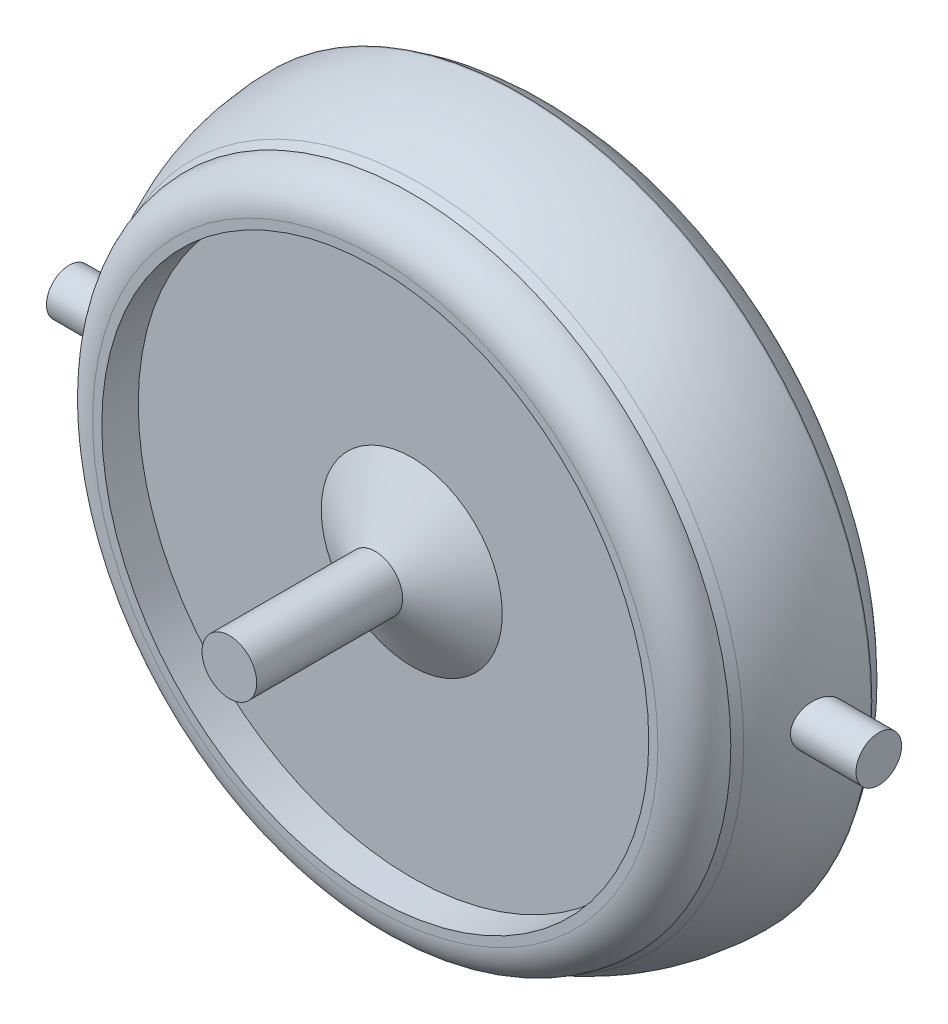
ISO-10303-21;
HEADER;
FILE_DESCRIPTION(('STEP AP214'),'2;1');
FILE_NAME('part.step','',(''),(''),'','','');
FILE_SCHEMA(('AUTOMOTIVE_DESIGN { 1 0 10303 214 1 1 1 1 }'));
ENDSEC;
DATA;
#1=APPLICATION_CONTEXT('core data for automotive mechanical design processes');
#2=APPLICATION_PROTOCOL_DEFINITION('international standard','automotive_design',2000,#1);
#3=PRODUCT_CONTEXT('',#1,'mechanical');
#4=PRODUCT('Part','Part','',(#3));
#5=PRODUCT_RELATED_PRODUCT_CATEGORY('part','',(#4));
#6=PRODUCT_DEFINITION_FORMATION('','',#4);
#7=PRODUCT_DEFINITION_CONTEXT('part definition',#1,'design');
#8=PRODUCT_DEFINITION('design','',#6,#7);
#9=PRODUCT_DEFINITION_SHAPE('','',#8);
#10=(LENGTH_UNIT() NAMED_UNIT(*) SI_UNIT(.MILLI.,.METRE.));
#11=(NAMED_UNIT(*) PLANE_ANGLE_UNIT() SI_UNIT($,.RADIAN.));
#12=(NAMED_UNIT(*) SI_UNIT($,.STERADIAN.) SOLID_ANGLE_UNIT());
#13=UNCERTAINTY_MEASURE_WITH_UNIT(LENGTH_MEASURE(1.E-05),#10,'distance_accuracy_value','');
#14=(GEOMETRIC_REPRESENTATION_CONTEXT(3) GLOBAL_UNCERTAINTY_ASSIGNED_CONTEXT((#13)) GLOBAL_UNIT_ASSIGNED_CONTEXT((#10,
#11,#12)) REPRESENTATION_CONTEXT('',''));
#15=CARTESIAN_POINT('',(0.,0.,0.));
#16=DIRECTION('',(0.,0.,1.));
#17=DIRECTION('',(1.,0.,0.));
#18=AXIS2_PLACEMENT_3D('',#15,#16,#17);
#19=CARTESIAN_POINT('',(0.,0.,-20.));
#20=DIRECTION('',(0.,0.,1.));
#21=DIRECTION('',(1.,0.,0.));
#22=AXIS2_PLACEMENT_3D('',#19,#20,#21);
#23=TOROIDAL_SURFACE('',#22,155.,20.);
#24=CARTESIAN_POINT('',(0.,0.,0.));
#25=DIRECTION('',(0.,0.,1.));
#26=DIRECTION('',(1.,0.,0.));
#27=AXIS2_PLACEMENT_3D('',#24,#25,#26);
#28=CIRCLE('',#27,155.);
#29=CARTESIAN_POINT('',(155.,0.,0.));
#30=VERTEX_POINT('',#29);
#31=EDGE_CURVE('E48',#30,#30,#28,.T.);
#32=ORIENTED_EDGE('',*,*,#31,.F.);
#33=EDGE_LOOP('',(#32));
#34=FACE_BOUND('',#33,.T.);
#35=CARTESIAN_POINT('',(0.,0.,-20.));
#36=DIRECTION('',(0.,0.,1.));
#37=DIRECTION('',(1.,0.,0.));
#38=AXIS2_PLACEMENT_3D('',#35,#36,#37);
#39=CIRCLE('',#38,175.);
#40=CARTESIAN_POINT('',(175.,0.,-20.));
#41=VERTEX_POINT('',#40);
#42=EDGE_CURVE('E122',#41,#41,#39,.T.);
#43=ORIENTED_EDGE('',*,*,#42,.T.);
#44=EDGE_LOOP('',(#43));
#45=FACE_BOUND('',#44,.T.);
#46=ADVANCED_FACE('F34',(#34,#45),#23,.T.);
#47=CARTESIAN_POINT('',(0.,0.,-79.4744111674235));
#48=DIRECTION('',(0.,0.,-1.));
#49=DIRECTION('',(-1.,0.,0.));
#50=AXIS2_PLACEMENT_3D('',#47,#48,#49);
#51=DEGENERATE_TOROIDAL_SURFACE('',#50,82.3205080756888,110.,.T.);
#52=CARTESIAN_POINT('',(-190.824444643148,-9.31146296495633,-62.8138750275506));
#53=CARTESIAN_POINT('',(-190.772154398822,-9.54905534655676,-62.548592672671));
#54=CARTESIAN_POINT('',(-190.717466797623,-9.77504754670534,-62.2734342153818));
#55=CARTESIAN_POINT('',(-190.603492416478,-10.2024275375353,-61.7053744554419));
#56=CARTESIAN_POINT('',(-190.54420421522,-10.4038076746776,-61.4124676757888));
#57=CARTESIAN_POINT('',(-190.421230115258,-10.780786925617,-60.8108773184113));
#58=CARTESIAN_POINT('',(-190.357538898841,-10.9563540349435,-60.5021747845845));
#59=CARTESIAN_POINT('',(-190.226120726259,-11.280316818481,-59.8716407387322));
#60=CARTESIAN_POINT('',(-190.158393633788,-11.4287115742986,-59.5498087833971));
#61=CARTESIAN_POINT('',(-190.019345686387,-11.6972382080356,-58.8958786612554));
#62=CARTESIAN_POINT('',(-189.948030122644,-11.8174102984513,-58.5637958734478));
#63=CARTESIAN_POINT('',(-189.802093681356,-12.0290887054402,-57.8913228356103));
#64=CARTESIAN_POINT('',(-189.72747275145,-12.120594567717,-57.5509324540154));
#65=CARTESIAN_POINT('',(-189.575366274799,-12.2744406017119,-56.8643566640349));
#66=CARTESIAN_POINT('',(-189.497881504837,-12.3367886204081,-56.5181728407908));
#67=CARTESIAN_POINT('',(-189.340486150137,-12.4320735857481,-55.8223253353816));
#68=CARTESIAN_POINT('',(-189.260575523279,-12.4650100213897,-55.4726615928623));
#69=CARTESIAN_POINT('',(-189.097522078931,-12.5016637597686,-54.7665994993043));
#70=CARTESIAN_POINT('',(-189.014347923909,-12.5049015030484,-54.4101834462934));
#71=CARTESIAN_POINT('',(-188.846571406046,-12.4809848981662,-53.698709876256));
#72=CARTESIAN_POINT('',(-188.761969027654,-12.4538302188709,-53.3436523740736));
#73=CARTESIAN_POINT('',(-188.591925007762,-12.3693781324518,-52.637287356757));
#74=CARTESIAN_POINT('',(-188.50648324294,-12.3120762290592,-52.2859804089707));
#75=CARTESIAN_POINT('',(-188.335413480224,-12.1677522408625,-51.5895788651654));
#76=CARTESIAN_POINT('',(-188.249785484939,-12.0807305697545,-51.2444841827427));
#77=CARTESIAN_POINT('',(-188.077769681326,-11.8760684130724,-50.5578838368537));
#78=CARTESIAN_POINT('',(-187.99138899308,-11.7580000740333,-50.2165038261935));
#79=CARTESIAN_POINT('',(-187.819865309836,-11.492646426481,-49.544966479468));
#80=CARTESIAN_POINT('',(-187.734722330251,-11.3453607544517,-49.2148092830946));
#81=CARTESIAN_POINT('',(-187.56644020093,-11.0225107889275,-48.5680682811752));
#82=CARTESIAN_POINT('',(-187.483301131772,-10.8469453604478,-48.2514850210541));
#83=CARTESIAN_POINT('',(-187.31982575931,-10.4686564091982,-47.6342166606757));
#84=CARTESIAN_POINT('',(-187.239489434323,-10.2659330965939,-47.3335314374141));
#85=CARTESIAN_POINT('',(-187.082732484018,-9.83544307089484,-46.7514193260834));
#86=CARTESIAN_POINT('',(-187.006298108372,-9.60777469725488,-46.4699234404375));
#87=CARTESIAN_POINT('',(-186.857833305972,-9.12823130473341,-45.9270990196697));
#88=CARTESIAN_POINT('',(-186.78580289118,-8.87635622010569,-45.6657705393266));
#89=CARTESIAN_POINT('',(-186.646968604136,-8.35008611999949,-45.1653895758839));
#90=CARTESIAN_POINT('',(-186.580164227515,-8.0756932829814,-44.9263349426874));
#91=CARTESIAN_POINT('',(-186.452576977031,-7.5062367740522,-44.472462949765));
#92=CARTESIAN_POINT('',(-186.391793944843,-7.21117364599163,-44.2576449527433));
#93=CARTESIAN_POINT('',(-186.278571168844,-6.61068737252803,-43.8595606646593));
#94=CARTESIAN_POINT('',(-186.225950391485,-6.30575944147743,-43.6755987818476));
#95=CARTESIAN_POINT('',(-186.127804438396,-5.68042349207881,-43.3339569589769));
#96=CARTESIAN_POINT('',(-186.082279158944,-5.36001570010491,-43.1762766347323));
#97=CARTESIAN_POINT('',(-185.99893654424,-4.70609668179875,-42.8886347249367));
#98=CARTESIAN_POINT('',(-185.961117675182,-4.37258807870969,-42.7586676233904));
#99=CARTESIAN_POINT('',(-185.893700167035,-3.694903700446,-42.5276194205384));
#100=CARTESIAN_POINT('',(-185.86410128241,-3.3507282442369,-42.4265374564168));
#101=CARTESIAN_POINT('',(-185.814503230369,-2.66755056997862,-42.2574851956055));
#102=CARTESIAN_POINT('',(-185.79418315025,-2.32884552597479,-42.1884065472631));
#103=CARTESIAN_POINT('',(-185.761819047089,-1.64649363549771,-42.0785058422062));
#104=CARTESIAN_POINT('',(-185.74977480376,-1.30284692081051,-42.037683033377));
#105=CARTESIAN_POINT('',(-185.734129674787,-0.613209728425122,-41.9846729069206));
#106=CARTESIAN_POINT('',(-185.730527597687,-0.267219588371021,-41.972481548496));
#107=CARTESIAN_POINT('',(-185.731813583944,0.424563000977358,-41.9768359302425));
#108=CARTESIAN_POINT('',(-185.736701562515,0.770355452211331,-41.9933813834375));
#109=CARTESIAN_POINT('',(-185.754685027853,1.45105987187886,-42.0543289372704));
#110=CARTESIAN_POINT('',(-185.767585064945,1.78603664801966,-42.0980676976102));
#111=CARTESIAN_POINT('',(-185.801245151596,2.45096373565729,-42.2124140326257));
#112=CARTESIAN_POINT('',(-185.822005045533,2.7809141465401,-42.2830210753177));
#113=CARTESIAN_POINT('',(-185.871116442435,3.43349777753261,-42.4504944384726));
#114=CARTESIAN_POINT('',(-185.899467910355,3.75613103141392,-42.5473606377122));
#115=CARTESIAN_POINT('',(-185.963405501083,4.3918960988698,-42.7665372444472));
#116=CARTESIAN_POINT('',(-185.998991714977,4.70502779276175,-42.8888479722921));
#117=CARTESIAN_POINT('',(-186.07724839035,5.32195824712605,-43.1588923593359));
#118=CARTESIAN_POINT('',(-186.119968472106,5.62567261014562,-43.3068043738458));
#119=CARTESIAN_POINT('',(-186.211799899169,6.21939806264642,-43.6262440532648));
#120=CARTESIAN_POINT('',(-186.260911247824,6.50940914494825,-43.7977717305464));
#121=CARTESIAN_POINT('',(-186.364970519136,7.07394354112103,-44.1631367058774));
#122=CARTESIAN_POINT('',(-186.41991893112,7.34846555356684,-44.3569758744389));
#123=CARTESIAN_POINT('',(-186.53505513437,7.88035584979272,-44.7655256048987));
#124=CARTESIAN_POINT('',(-186.595243217942,8.13772317514783,-44.980237331293));
#125=CARTESIAN_POINT('',(-186.722233693888,8.6417197186181,-45.4361698892849));
#126=CARTESIAN_POINT('',(-186.789185923324,8.88774362331119,-45.6780182777428));
#127=CARTESIAN_POINT('',(-186.92731119688,9.35843946933554,-46.1805494495836));
#128=CARTESIAN_POINT('',(-186.998484317659,9.58311102268168,-46.4412325750536));
#129=CARTESIAN_POINT('',(-187.144361232798,10.009816327705,-46.9796408339249));
#130=CARTESIAN_POINT('',(-187.219065510143,10.2118469697777,-47.2573683001855));
#131=CARTESIAN_POINT('',(-187.371302209652,10.5920781421822,-47.8279515934893));
#132=CARTESIAN_POINT('',(-187.448834714295,10.7702779768324,-48.1208078618345));
#133=CARTESIAN_POINT('',(-187.608851765743,11.1077471392827,-48.7304045566454));
#134=CARTESIAN_POINT('',(-187.691414298364,11.2661142035105,-49.0476243421322));
#135=CARTESIAN_POINT('',(-187.858104289682,11.555224063729,-49.6940181817911));
#136=CARTESIAN_POINT('',(-187.942231784942,11.6859662134223,-50.0231925154343));
#137=CARTESIAN_POINT('',(-188.111350020664,11.9190238958307,-50.6912845543656));
#138=CARTESIAN_POINT('',(-188.196340859477,12.0213361513198,-51.0302033779745));
#139=CARTESIAN_POINT('',(-188.366493638242,12.1968524685485,-51.7154471897483));
#140=CARTESIAN_POINT('',(-188.451655576215,12.2700568652461,-52.0617720926395));
#141=CARTESIAN_POINT('',(-188.623187273029,12.3880121117202,-52.7664091326441));
#142=CARTESIAN_POINT('',(-188.70954756328,12.4321709320853,-53.1248228465268));
#143=CARTESIAN_POINT('',(-188.881125659083,12.4893298503206,-53.8444038850163));
#144=CARTESIAN_POINT('',(-188.966343446462,12.5023294531538,-54.20557125328));
#145=CARTESIAN_POINT('',(-189.135028446714,12.4969872060847,-54.9280931047779));
#146=CARTESIAN_POINT('',(-189.218495629133,12.4786448114343,-55.2894475911553));
#147=CARTESIAN_POINT('',(-189.383110452184,12.4106266816276,-56.0097288754551));
#148=CARTESIAN_POINT('',(-189.464258110812,12.3609511896556,-56.3686556921975));
#149=CARTESIAN_POINT('',(-189.623498756146,12.2306525641353,-57.0805028250036));
#150=CARTESIAN_POINT('',(-189.701599303446,12.1501122138981,-57.4334365933155));
#151=CARTESIAN_POINT('',(-189.854498770183,11.9584962401675,-58.1316534513931));
#152=CARTESIAN_POINT('',(-189.929297683406,11.847420559206,-58.4769365267586));
#153=CARTESIAN_POINT('',(-190.075158876904,11.5953846337607,-59.1572116331548));
#154=CARTESIAN_POINT('',(-190.146221390762,11.4544262601953,-59.4922043069522));
#155=CARTESIAN_POINT('',(-190.2842291729,11.1434937455123,-60.1493263572114));
#156=CARTESIAN_POINT('',(-190.351174507262,10.9735200702686,-60.4714559401025));
#157=CARTESIAN_POINT('',(-190.479441174639,10.6089829561722,-61.0946405095022));
#158=CARTESIAN_POINT('',(-190.540842120227,10.4149178817747,-61.3959706776011));
#159=CARTESIAN_POINT('',(-190.659065746614,10.0011498783092,-61.9814405423647));
#160=CARTESIAN_POINT('',(-190.715888471868,9.78144719824283,-62.2655804059471));
#161=CARTESIAN_POINT('',(-190.824709493936,9.31791522081903,-62.8144029282506));
#162=CARTESIAN_POINT('',(-190.876708203199,9.07408798977325,-63.0790872499955));
#163=CARTESIAN_POINT('',(-190.975682084773,8.5639975637063,-63.5869001517666));
#164=CARTESIAN_POINT('',(-191.022657332422,8.29773470526199,-63.8300290550527));
#165=CARTESIAN_POINT('',(-191.110462361579,7.75062121069611,-64.2877873063102));
#166=CARTESIAN_POINT('',(-191.151402356789,7.47020603395655,-64.5029161356366));
#167=CARTESIAN_POINT('',(-191.228180575647,6.89169189587447,-64.9089433113612));
#168=CARTESIAN_POINT('',(-191.264018869804,6.59359317901701,-65.0998419926405));
#169=CARTESIAN_POINT('',(-191.330487844157,5.98186269842846,-65.4558752943962));
#170=CARTESIAN_POINT('',(-191.36111889921,5.66823205490499,-65.6210117693627));
#171=CARTESIAN_POINT('',(-191.417095567179,5.02769164354721,-65.9242088678016));
#172=CARTESIAN_POINT('',(-191.4424412289,4.70078199836282,-66.0622697412859));
#173=CARTESIAN_POINT('',(-191.487410700454,4.04158368624276,-66.3081468287361));
#174=CARTESIAN_POINT('',(-191.50712221812,3.70947342900421,-66.4164255317013));
#175=CARTESIAN_POINT('',(-191.541331687462,3.0371078393516,-66.6048632573658));
#176=CARTESIAN_POINT('',(-191.555829699313,2.69685260099755,-66.6850226046261));
#177=CARTESIAN_POINT('',(-191.579582072598,2.01067735429139,-66.8165829068953));
#178=CARTESIAN_POINT('',(-191.588836888105,1.66475783915062,-66.8679863522343));
#179=CARTESIAN_POINT('',(-191.602087111641,0.969729009898464,-66.9416380421241));
#180=CARTESIAN_POINT('',(-191.606082542622,0.62061970971408,-66.9638864139085));
#181=CARTESIAN_POINT('',(-191.608794599384,-0.075154315229183,-66.978984753917));
#182=CARTESIAN_POINT('',(-191.607557717781,-0.421813268075413,-66.9720936462288));
#183=CARTESIAN_POINT('',(-191.599912528338,-1.11330417694176,-66.9295524652976));
#184=CARTESIAN_POINT('',(-191.593504236549,-1.45813613862919,-66.893902481317));
#185=CARTESIAN_POINT('',(-191.575525892322,-2.14359918547361,-66.7941094656042));
#186=CARTESIAN_POINT('',(-191.563954609605,-2.48422924947779,-66.7299596427285));
#187=CARTESIAN_POINT('',(-191.535672420511,-3.15878120242317,-66.5736657715884));
#188=CARTESIAN_POINT('',(-191.518961590399,-3.49270319082822,-66.4815221387288));
#189=CARTESIAN_POINT('',(-191.480440821671,-4.15137428643747,-66.269990790581));
#190=CARTESIAN_POINT('',(-191.458632617957,-4.47612647254585,-66.1506123450437));
#191=CARTESIAN_POINT('',(-191.409961817175,-5.11430385533459,-65.8855148590633));
#192=CARTESIAN_POINT('',(-191.383099172762,-5.42772894587814,-65.7397955718788));
#193=CARTESIAN_POINT('',(-191.324414727016,-6.04074721971468,-65.4233026817878));
#194=CARTESIAN_POINT('',(-191.292598334768,-6.34035503320561,-65.2525564180587));
#195=CARTESIAN_POINT('',(-191.224079926484,-6.92395986645183,-64.8872533934947));
#196=CARTESIAN_POINT('',(-191.187379213976,-7.20796102283896,-64.6927029866242));
#197=CARTESIAN_POINT('',(-191.101122649441,-7.81531522065378,-64.2387659542666));
#198=CARTESIAN_POINT('',(-191.050476157019,-8.13471989975438,-63.9742795963704));
#199=CARTESIAN_POINT('',(-190.942441546554,-8.74509872288288,-63.4155764206484));
#200=CARTESIAN_POINT('',(-190.885053493678,-9.03607314168588,-63.1213598902172));
#201=CARTESIAN_POINT('',(-190.824444643148,-9.31146296495633,-62.8138750275506));
#202=B_SPLINE_CURVE_WITH_KNOTS('',3,(#52,#53,#54,#55,#56,#57,#58,#59,#60,#61,#62,#63,#64,#65,
#66,#67,#68,#69,#70,#71,#72,#73,#74,#75,#76,#77,#78,#79,#80,#81,#82,#83,#84,#85,#86,#87,#88,#89,
#90,#91,#92,#93,#94,#95,#96,#97,#98,#99,#100,#101,#102,#103,#104,#105,#106,#107,#108,#109,#110,
#111,#112,#113,#114,#115,#116,#117,#118,#119,#120,#121,#122,#123,#124,#125,#126,#127,#128,#129,
#130,#131,#132,#133,#134,#135,#136,#137,#138,#139,#140,#141,#142,#143,#144,#145,#146,#147,#148,
#149,#150,#151,#152,#153,#154,#155,#156,#157,#158,#159,#160,#161,#162,#163,#164,#165,#166,#167,
#168,#169,#170,#171,#172,#173,#174,#175,#176,#177,#178,#179,#180,#181,#182,#183,#184,#185,#186,
#187,#188,#189,#190,#191,#192,#193,#194,#195,#196,#197,#198,#199,#200,#201),.UNSPECIFIED.,.T.,
.F.,(4,2,2,2,2,2,2,2,2,2,2,2,2,2,2,2,2,2,2,2,2,2,2,2,2,2,2,2,2,2,2,2,2,2,2,2,2,2,2,2,2,2,2,2,2,
2,2,2,2,2,2,2,2,2,2,2,2,2,2,2,2,2,2,2,2,2,2,2,2,2,2,2,2,2,4),(0.,1.07945213144277,
2.15923908735849,3.2403537351069,4.32150491650367,5.40110616667952,6.48072452528675,
7.56005216885424,8.63939856449348,9.73614360904237,10.8329006030341,11.929821217822,
13.0267265642152,14.1396220524886,15.2525313880434,16.365485400434,17.4784308005476,
18.5871366594798,19.6958455297779,20.8044472651634,21.9130198433706,22.9916444009798,
24.0702531897907,25.1486470932301,26.2270087810538,27.2645592508367,28.3020821020154,
29.339458517317,30.3768245730681,31.3898280374652,32.4028114457473,33.4157901777528,
34.4287816640503,35.4491373875301,36.4694936455877,37.4899355089022,38.5104343361576,
39.5635196911461,40.6166241776746,41.6698731254952,42.7231528136056,43.8140123087954,
44.9048973223169,45.9959080343387,47.0869061912137,48.1995043762418,49.312120237374,
50.4247554368275,51.5373820009387,52.6470450179541,53.7567101233918,54.8663057745772,
55.9758836116084,57.0654645803929,58.1550349676569,59.2445121118911,60.3339729148165,
61.4000629680644,62.4661382854401,63.5321368260302,64.5981255228906,65.6464822741313,
66.6948269245587,67.7430807717642,68.791330044343,69.8302845740277,70.8692358789977,
71.9084348855395,72.9476184719872,73.9864488840124,75.0252890275332,76.0630026969078,
77.1004399744827,78.3516291039365,79.6028061395995),.UNSPECIFIED.);
#203=CARTESIAN_POINT('',(-190.824444643148,-9.31146296495633,-62.8138750275506));
#204=VERTEX_POINT('',#203);
#205=EDGE_CURVE('E10',#204,#204,#202,.T.);
#206=ORIENTED_EDGE('',*,*,#205,.F.);
#207=EDGE_LOOP('',(#206));
#208=FACE_BOUND('',#207,.T.);
#209=CARTESIAN_POINT('',(190.824444643148,-9.31146296495633,-62.8138750275506));
#210=CARTESIAN_POINT('',(190.875309722466,-9.08035482534818,-63.0719259504562));
#211=CARTESIAN_POINT('',(190.923893412932,-8.8383255559022,-63.320566868957));
#212=CARTESIAN_POINT('',(191.016360155146,-8.33387172284121,-63.7973402145832));
#213=CARTESIAN_POINT('',(191.060242223465,-8.0714429120181,-64.0254683494851));
#214=CARTESIAN_POINT('',(191.143180101353,-7.52777957167802,-64.4595833560948));
#215=CARTESIAN_POINT('',(191.182231643659,-7.24652874808173,-64.665550630393));
#216=CARTESIAN_POINT('',(191.255347353988,-6.66735429419393,-65.0535355132293));
#217=CARTESIAN_POINT('',(191.289411599218,-6.36943092210659,-65.2355534925187));
#218=CARTESIAN_POINT('',(191.35246322059,-5.75894815442959,-65.5742482572137));
#219=CARTESIAN_POINT('',(191.38144996373,-5.44638694012141,-65.7309218828119));
#220=CARTESIAN_POINT('',(191.434268965724,-4.80886773503714,-66.0176757041649));
#221=CARTESIAN_POINT('',(191.45810115048,-4.48390956612922,-66.1477555176225));
#222=CARTESIAN_POINT('',(191.500550932876,-3.82399430966985,-66.3802681013204));
#223=CARTESIAN_POINT('',(191.519169636519,-3.48903935957326,-66.482706735269));
#224=CARTESIAN_POINT('',(191.55115931817,-2.811480945664,-66.659160961486));
#225=CARTESIAN_POINT('',(191.564530347888,-2.46887755725442,-66.7331768338331));
#226=CARTESIAN_POINT('',(191.585907222094,-1.78143119319463,-66.8516939725394));
#227=CARTESIAN_POINT('',(191.593957548406,-1.43663176232299,-66.8964399063996));
#228=CARTESIAN_POINT('',(191.604857941783,-0.744423000457685,-66.9570607062684));
#229=CARTESIAN_POINT('',(191.607708033722,-0.397013681955327,-66.9729357103691));
#230=CARTESIAN_POINT('',(191.608202788245,0.297922172693054,-66.9756902411624));
#231=CARTESIAN_POINT('',(191.605847467526,0.645448708459508,-66.9625698608627));
#232=CARTESIAN_POINT('',(191.595935727222,1.33812723378494,-66.9074367652927));
#233=CARTESIAN_POINT('',(191.588379315767,1.68327922705494,-66.8654240951865));
#234=CARTESIAN_POINT('',(191.568123451825,2.36725470975427,-66.7530795725824));
#235=CARTESIAN_POINT('',(191.555446365597,2.70609910164566,-66.6828708832141));
#236=CARTESIAN_POINT('',(191.524974614539,3.37658664422932,-66.5146820187562));
#237=CARTESIAN_POINT('',(191.507179971225,3.70822982519352,-66.4167019604342));
#238=CARTESIAN_POINT('',(191.466509944645,4.3619822023686,-66.1937280507776));
#239=CARTESIAN_POINT('',(191.443634598743,4.68409146867731,-66.0687343981158));
#240=CARTESIAN_POINT('',(191.392853954192,5.31653364904021,-65.7926935776201));
#241=CARTESIAN_POINT('',(191.364948635544,5.62686651626841,-65.6416463062035));
#242=CARTESIAN_POINT('',(191.304069683773,6.23467112368237,-65.3140823594892));
#243=CARTESIAN_POINT('',(191.271078737945,6.53209430908396,-65.1374788152035));
#244=CARTESIAN_POINT('',(191.200187679552,7.11088510644183,-64.760546670779));
#245=CARTESIAN_POINT('',(191.162287564713,7.3922527109618,-64.5602180596518));
#246=CARTESIAN_POINT('',(191.081687461896,7.93704004854575,-64.1373455893543));
#247=CARTESIAN_POINT('',(191.038987370245,8.20045939375727,-63.9148012503698));
#248=CARTESIAN_POINT('',(190.948923255704,8.70760095452673,-63.4491641808215));
#249=CARTESIAN_POINT('',(190.901559194138,8.95132300671787,-63.2060712798647));
#250=CARTESIAN_POINT('',(190.801771558506,9.4201159287994,-62.6982883909508));
#251=CARTESIAN_POINT('',(190.749297049244,9.6449460652111,-62.4333861610465));
#252=CARTESIAN_POINT('',(190.639945320519,10.071399358587,-61.8863737876716));
#253=CARTESIAN_POINT('',(190.583068076496,10.2730223860749,-61.6042635482082));
#254=CARTESIAN_POINT('',(190.46514086568,10.6518125921661,-61.024883385664));
#255=CARTESIAN_POINT('',(190.404090660174,10.8289783699434,-60.7276125955741));
#256=CARTESIAN_POINT('',(190.27808851072,11.1577743038541,-60.1200629134813));
#257=CARTESIAN_POINT('',(190.213136520931,11.3094041598931,-59.8097838686608));
#258=CARTESIAN_POINT('',(190.07841693767,11.5887775281472,-59.1726477263276));
#259=CARTESIAN_POINT('',(190.008583131653,11.7160350832569,-58.8455915058278));
#260=CARTESIAN_POINT('',(189.865545386869,11.942443833027,-58.1826104690575));
#261=CARTESIAN_POINT('',(189.792341412059,12.0415947270246,-57.8466855579589));
#262=CARTESIAN_POINT('',(189.642957442552,12.2112724809303,-57.168307908314));
#263=CARTESIAN_POINT('',(189.56677723538,12.2817972930906,-56.8258547046045));
#264=CARTESIAN_POINT('',(189.411881534507,12.3938824613494,-56.1367973048699));
#265=CARTESIAN_POINT('',(189.333165935741,12.435441615502,-55.7901929371969));
#266=CARTESIAN_POINT('',(189.171980762485,12.4900144789858,-55.0877984656561));
#267=CARTESIAN_POINT('',(189.089466953081,12.5024022396654,-54.731969786742));
#268=CARTESIAN_POINT('',(188.922841819211,12.4968299905964,-54.0209242510388));
#269=CARTESIAN_POINT('',(188.838730472117,12.4788695506831,-53.6657074029933));
#270=CARTESIAN_POINT('',(188.66948899877,12.4127999398531,-52.9582945136349));
#271=CARTESIAN_POINT('',(188.584358766747,12.3646876117822,-52.6060987925743));
#272=CARTESIAN_POINT('',(188.413714805701,12.2386846019522,-51.9071767087463));
#273=CARTESIAN_POINT('',(188.328201081508,12.1607942942649,-51.5604502773305));
#274=CARTESIAN_POINT('',(188.156127441681,11.9743359076258,-50.8695132467625));
#275=CARTESIAN_POINT('',(188.069571800202,11.8653119989462,-50.5254244927261));
#276=CARTESIAN_POINT('',(187.897470540311,11.6178304889961,-49.8477335010295));
#277=CARTESIAN_POINT('',(187.811924935075,11.4793725042316,-49.5141314000641));
#278=CARTESIAN_POINT('',(187.642598954869,11.1739077780097,-48.85977285212));
#279=CARTESIAN_POINT('',(187.558818665695,11.0068996525982,-48.539017028789));
#280=CARTESIAN_POINT('',(187.393814308859,10.6454012008383,-47.912690929039));
#281=CARTESIAN_POINT('',(187.312590224828,10.4509110505113,-47.6071205553747));
#282=CARTESIAN_POINT('',(187.153671584005,10.0361177648156,-47.0140484162238));
#283=CARTESIAN_POINT('',(187.075970011444,9.81586937681957,-46.726510254473));
#284=CARTESIAN_POINT('',(186.924731801332,9.35064475745908,-46.1709963729165));
#285=CARTESIAN_POINT('',(186.85119517966,9.10566843183028,-45.9030207276908));
#286=CARTESIAN_POINT('',(186.709112775495,8.59261507829055,-45.3887701240132));
#287=CARTESIAN_POINT('',(186.640566582314,8.32453995527731,-45.1424933794908));
#288=CARTESIAN_POINT('',(186.509269530465,7.76708418190657,-44.6736440254237));
#289=CARTESIAN_POINT('',(186.446518526201,7.47770406713279,-44.4510708203425));
#290=CARTESIAN_POINT('',(186.329109765525,6.88727531684587,-44.0368753490547));
#291=CARTESIAN_POINT('',(186.274286720072,6.58671086120291,-43.8446097034136));
#292=CARTESIAN_POINT('',(186.171576262104,5.96934269840254,-43.4860369681506));
#293=CARTESIAN_POINT('',(186.123688757609,5.65253920668883,-43.3197295342589));
#294=CARTESIAN_POINT('',(186.035488317388,5.00502935902196,-43.0145790478631));
#295=CARTESIAN_POINT('',(185.995173883331,4.67432576907985,-42.8757305623221));
#296=CARTESIAN_POINT('',(185.922662589534,4.00142061515309,-42.6267397177341));
#297=CARTESIAN_POINT('',(185.890465481949,3.65921940258251,-42.5165964822372));
#298=CARTESIAN_POINT('',(185.83570361865,2.97908065737173,-42.3296708680382));
#299=CARTESIAN_POINT('',(185.812820367134,2.6414721026573,-42.2517834438748));
#300=CARTESIAN_POINT('',(185.77530185936,1.96051186987623,-42.1242542804112));
#301=CARTESIAN_POINT('',(185.760666386285,1.61716034302562,-42.0746117986054));
#302=CARTESIAN_POINT('',(185.739847250561,0.927316682118189,-42.0040348900887));
#303=CARTESIAN_POINT('',(185.733662324895,0.580825025179133,-41.9830961733143));
#304=CARTESIAN_POINT('',(185.729826842626,-0.112745557438239,-41.9701085133929));
#305=CARTESIAN_POINT('',(185.732176184323,-0.459824476069063,-41.9780592259789));
#306=CARTESIAN_POINT('',(185.745207786466,-1.14315881991946,-42.0222056012906));
#307=CARTESIAN_POINT('',(185.755676901935,-1.47946526206784,-42.0576788038412));
#308=CARTESIAN_POINT('',(185.784550276786,-2.14776048393555,-42.1556784375885));
#309=CARTESIAN_POINT('',(185.802954369713,-2.47974935407589,-42.2182043012904));
#310=CARTESIAN_POINT('',(185.847457605333,-3.13708367448097,-42.3697644621145));
#311=CARTESIAN_POINT('',(185.87355662745,-3.46242922875863,-42.4587983438659));
#312=CARTESIAN_POINT('',(185.933117840961,-4.10425705827454,-42.6626183698545));
#313=CARTESIAN_POINT('',(185.966580115315,-4.42073923360737,-42.7774048042355));
#314=CARTESIAN_POINT('',(186.040634697822,-5.04424341390159,-43.0324005641699));
#315=CARTESIAN_POINT('',(186.081260932532,-5.35121184754746,-43.1727309657982));
#316=CARTESIAN_POINT('',(186.169043140565,-5.95206482883583,-43.4773035908506));
#317=CARTESIAN_POINT('',(186.216199106619,-6.24594939104594,-43.6415457876503));
#318=CARTESIAN_POINT('',(186.31650224693,-6.81881102875485,-43.9926797840626));
#319=CARTESIAN_POINT('',(186.369649897956,-7.09778691533614,-44.1795733861774));
#320=CARTESIAN_POINT('',(186.481352158357,-7.63912680392615,-44.5746116894359));
#321=CARTESIAN_POINT('',(186.539907067806,-7.90148988264726,-44.7827575700378));
#322=CARTESIAN_POINT('',(186.663683618978,-8.41583590392851,-45.2255002481279));
#323=CARTESIAN_POINT('',(186.729054750502,-8.66725282808899,-45.4607129513564));
#324=CARTESIAN_POINT('',(186.864202822944,-9.14927768951118,-45.9504002880679));
#325=CARTESIAN_POINT('',(186.933979839657,-9.37988526862032,-46.204875252938));
#326=CARTESIAN_POINT('',(187.077255376356,-9.81897009642628,-46.7313285367118));
#327=CARTESIAN_POINT('',(187.150754409053,-10.0274442839226,-47.0033092684498));
#328=CARTESIAN_POINT('',(187.300774992309,-10.4210335306099,-47.562893170529));
#329=CARTESIAN_POINT('',(187.377296634025,-10.6061478846047,-47.8504968121262));
#330=CARTESIAN_POINT('',(187.535496231099,-10.9582283005586,-48.4500911727665));
#331=CARTESIAN_POINT('',(187.617260563922,-11.1242944792963,-48.7625878543747));
#332=CARTESIAN_POINT('',(187.782564678046,-11.4292025427876,-49.4001428771544));
#333=CARTESIAN_POINT('',(187.866104501326,-11.568043783058,-49.7252015154812));
#334=CARTESIAN_POINT('',(188.034251760703,-11.817655824683,-50.385688150602));
#335=CARTESIAN_POINT('',(188.118859285128,-11.928424287416,-50.7211170086842));
#336=CARTESIAN_POINT('',(188.28844807788,-12.1211723288375,-51.4000481441234));
#337=CARTESIAN_POINT('',(188.373429343085,-12.2031521474468,-51.7435503541726));
#338=CARTESIAN_POINT('',(188.544924527478,-12.339212717072,-52.4437193710082));
#339=CARTESIAN_POINT('',(188.631432478898,-12.3926611510582,-52.8005106990607));
#340=CARTESIAN_POINT('',(188.80349967912,-12.4685417756596,-53.5176103914997));
#341=CARTESIAN_POINT('',(188.889058908451,-12.4909733308282,-53.8779188277893));
#342=CARTESIAN_POINT('',(189.05863056856,-12.5045836164323,-54.5995937299211));
#343=CARTESIAN_POINT('',(189.142642580158,-12.4957539991007,-54.9609604526173));
#344=CARTESIAN_POINT('',(189.308515669783,-12.4467740432412,-55.6820563389237));
#345=CARTESIAN_POINT('',(189.390376794598,-12.4066243865928,-56.0417855380136));
#346=CARTESIAN_POINT('',(189.551366430761,-12.2951866348767,-56.7567812442721));
#347=CARTESIAN_POINT('',(189.630496544419,-12.223917145112,-57.112050287631));
#348=CARTESIAN_POINT('',(189.785583489651,-12.0506034883446,-57.8157057327382));
#349=CARTESIAN_POINT('',(189.861540362895,-11.9485597255978,-58.1640922248328));
#350=CARTESIAN_POINT('',(190.00975672655,-11.714396579084,-58.850986932028));
#351=CARTESIAN_POINT('',(190.082020166746,-11.5823101837631,-59.1895055260462));
#352=CARTESIAN_POINT('',(190.222514874234,-11.2888632864213,-59.8543365752618));
#353=CARTESIAN_POINT('',(190.290747215302,-11.1275106271829,-60.1806522724057));
#354=CARTESIAN_POINT('',(190.442514352905,-10.7242670163986,-60.9136007922629));
#355=CARTESIAN_POINT('',(190.524565632774,-10.4726948142948,-61.3152604436543));
#356=CARTESIAN_POINT('',(190.680655999327,-9.92474738235523,-62.0884694258657));
#357=CARTESIAN_POINT('',(190.754695240049,-9.62837301414346,-62.4600193355378));
#358=CARTESIAN_POINT('',(190.824444643148,-9.31146296495633,-62.8138750275506));
#359=B_SPLINE_CURVE_WITH_KNOTS('',3,(#209,#210,#211,#212,#213,#214,#215,#216,#217,#218,#219,
#220,#221,#222,#223,#224,#225,#226,#227,#228,#229,#230,#231,#232,#233,#234,#235,#236,#237,#238,
#239,#240,#241,#242,#243,#244,#245,#246,#247,#248,#249,#250,#251,#252,#253,#254,#255,#256,#257,
#258,#259,#260,#261,#262,#263,#264,#265,#266,#267,#268,#269,#270,#271,#272,#273,#274,#275,#276,
#277,#278,#279,#280,#281,#282,#283,#284,#285,#286,#287,#288,#289,#290,#291,#292,#293,#294,#295,
#296,#297,#298,#299,#300,#301,#302,#303,#304,#305,#306,#307,#308,#309,#310,#311,#312,#313,#314,
#315,#316,#317,#318,#319,#320,#321,#322,#323,#324,#325,#326,#327,#328,#329,#330,#331,#332,#333,
#334,#335,#336,#337,#338,#339,#340,#341,#342,#343,#344,#345,#346,#347,#348,#349,#350,#351,#352,
#353,#354,#355,#356,#357,#358),.UNSPECIFIED.,.T.,.F.,(4,2,2,2,2,2,2,2,2,2,2,2,2,2,2,2,2,2,2,2,2,
2,2,2,2,2,2,2,2,2,2,2,2,2,2,2,2,2,2,2,2,2,2,2,2,2,2,2,2,2,2,2,2,2,2,2,2,2,2,2,2,2,2,2,2,2,2,2,2,
2,2,2,2,2,4),(0.,1.04997238665449,2.10016396732016,3.15127675523585,4.20237326929755,
5.25360072799179,6.30484329746564,7.35586268418579,8.40687171387004,9.44897911532214,
10.4910815322688,11.5331806064937,12.5752780517227,13.6128721752624,14.6504619361961,
15.6880440663868,16.7256303218398,17.7668301269941,18.8080304143876,19.8492531944418,
20.8904846093771,21.943432535456,22.9963863358194,24.0494004207041,25.1024268795887,
26.1746542159853,27.246893021784,28.3192085159646,29.3915685038122,30.4867370630125,
31.5819211455974,32.677219922262,33.7725049402068,34.8847295764757,35.9969687047158,
37.1092617635039,38.2215476984228,39.3315110995777,40.4414787321382,41.5513549160051,
42.6612032083439,43.7428149524134,44.8244123504251,45.9057955286229,46.9871456853673,
48.0275610900639,49.0679491429638,50.1081816825504,51.14840182603,52.1622036834744,
53.1759842750119,54.1897489818234,55.2035251108998,56.2222378697952,57.2409494944244,
58.2597422370735,59.2785915514123,60.3287223720779,61.378871263247,62.4291652085477,
63.4794908529644,64.5678493971486,65.6562337024273,66.7447086465128,67.833174519175,
68.9448549992948,70.0565582542116,71.168558393055,72.2805343228359,73.3918463550092,
74.503143789438,75.6132268000279,76.723012768565,78.1628287779709,79.6026171007188),.UNSPECIFIED.);
#360=CARTESIAN_POINT('',(190.824444643148,-9.31146296495633,-62.8138750275506));
#361=VERTEX_POINT('',#360);
#362=EDGE_CURVE('E44',#361,#361,#359,.T.);
#363=ORIENTED_EDGE('',*,*,#362,.F.);
#364=EDGE_LOOP('',(#363));
#365=FACE_BOUND('',#364,.T.);
#366=CARTESIAN_POINT('',(0.,0.,-24.4744111674235));
#367=DIRECTION('',(0.,0.,1.));
#368=DIRECTION('',(1.,0.,0.));
#369=AXIS2_PLACEMENT_3D('',#366,#367,#368);
#370=CIRCLE('',#369,177.583302491977);
#371=CARTESIAN_POINT('',(177.583302491977,0.,-24.4744111674235));
#372=VERTEX_POINT('',#371);
#373=EDGE_CURVE('E143',#372,#372,#370,.T.);
#374=ORIENTED_EDGE('',*,*,#373,.F.);
#375=EDGE_LOOP('',(#374));
#376=FACE_BOUND('',#375,.T.);
#377=CARTESIAN_POINT('',(0.,0.,-79.4744111674235));
#378=DIRECTION('',(0.,0.,-1.));
#379=DIRECTION('',(-1.,0.,0.));
#380=AXIS2_PLACEMENT_3D('',#377,#378,#379);
#381=CIRCLE('',#380,192.320508075689);
#382=CARTESIAN_POINT('',(-192.320508075689,0.,-79.4744111674235));
#383=VERTEX_POINT('',#382);
#384=EDGE_CURVE('E52',#383,#383,#381,.T.);
#385=ORIENTED_EDGE('',*,*,#384,.F.);
#386=EDGE_LOOP('',(#385));
#387=FACE_BOUND('',#386,.T.);
#388=ADVANCED_FACE('F58',(#208,#365,#376,#387),#51,.T.);
#389=CARTESIAN_POINT('',(0.,0.,-50.));
#390=DIRECTION('',(0.,0.,-1.));
#391=DIRECTION('',(-1.,0.,0.));
#392=AXIS2_PLACEMENT_3D('',#389,#390,#391);
#393=TOROIDAL_SURFACE('',#392,140.358983848623,60.);
#394=CARTESIAN_POINT('',(0.,0.,-80.));
#395=DIRECTION('',(0.,0.,-1.));
#396=DIRECTION('',(-1.,0.,0.));
#397=AXIS2_PLACEMENT_3D('',#394,#395,#396);
#398=CIRCLE('',#397,192.320508075689);
#399=CARTESIAN_POINT('',(-192.320508075689,0.,-80.));
#400=VERTEX_POINT('',#399);
#401=EDGE_CURVE('E150',#400,#400,#398,.T.);
#402=ORIENTED_EDGE('',*,*,#401,.T.);
#403=EDGE_LOOP('',(#402));
#404=FACE_BOUND('',#403,.T.);
#405=CARTESIAN_POINT('',(0.,0.,-110.));
#406=DIRECTION('',(0.,0.,-1.));
#407=DIRECTION('',(-1.,0.,0.));
#408=AXIS2_PLACEMENT_3D('',#405,#406,#407);
#409=CIRCLE('',#408,140.358983848623);
#410=CARTESIAN_POINT('',(-140.358983848623,0.,-110.));
#411=VERTEX_POINT('',#410);
#412=EDGE_CURVE('E140',#411,#411,#409,.T.);
#413=ORIENTED_EDGE('',*,*,#412,.F.);
#414=EDGE_LOOP('',(#413));
#415=FACE_BOUND('',#414,.T.);
#416=ADVANCED_FACE('F92',(#404,#415),#393,.T.);
#417=CARTESIAN_POINT('',(0.,0.,-20.));
#418=DIRECTION('',(0.,0.,-1.));
#419=DIRECTION('',(-1.,0.,0.));
#420=AXIS2_PLACEMENT_3D('',#417,#418,#419);
#421=PLANE('',#420);
#422=CARTESIAN_POINT('',(0.,0.,-20.));
#423=DIRECTION('',(0.,0.,-1.));
#424=DIRECTION('',(-1.,0.,0.));
#425=AXIS2_PLACEMENT_3D('',#422,#423,#424);
#426=CIRCLE('',#425,49.6410161513776);
#427=CARTESIAN_POINT('',(-49.6410161513776,0.,-20.));
#428=VERTEX_POINT('',#427);
#429=EDGE_CURVE('E128',#428,#428,#426,.T.);
#430=ORIENTED_EDGE('',*,*,#429,.T.);
#431=EDGE_LOOP('',(#430));
#432=FACE_BOUND('',#431,.T.);
#433=CARTESIAN_POINT('',(0.,0.,-20.));
#434=DIRECTION('',(0.,0.,1.));
#435=DIRECTION('',(1.,0.,0.));
#436=AXIS2_PLACEMENT_3D('',#433,#434,#435);
#437=CIRCLE('',#436,150.);
#438=CARTESIAN_POINT('',(150.,0.,-20.));
#439=VERTEX_POINT('',#438);
#440=EDGE_CURVE('E131',#439,#439,#437,.T.);
#441=ORIENTED_EDGE('',*,*,#440,.T.);
#442=EDGE_LOOP('',(#441));
#443=FACE_BOUND('',#442,.T.);
#444=ADVANCED_FACE('F88',(#432,#443),#421,.F.);
#445=CARTESIAN_POINT('',(0.,0.,80.));
#446=DIRECTION('',(0.,0.,-1.));
#447=DIRECTION('',(-1.,0.,0.));
#448=AXIS2_PLACEMENT_3D('',#445,#446,#447);
#449=CYLINDRICAL_SURFACE('',#448,15.);
#450=CARTESIAN_POINT('',(0.,0.,80.));
#451=DIRECTION('',(0.,0.,1.));
#452=DIRECTION('',(1.,0.,0.));
#453=AXIS2_PLACEMENT_3D('',#450,#451,#452);
#454=CIRCLE('',#453,15.);
#455=CARTESIAN_POINT('',(15.,0.,80.));
#456=VERTEX_POINT('',#455);
#457=EDGE_CURVE('E137',#456,#456,#454,.T.);
#458=ORIENTED_EDGE('',*,*,#457,.F.);
#459=EDGE_LOOP('',(#458));
#460=FACE_BOUND('',#459,.T.);
#461=CARTESIAN_POINT('',(0.,0.,0.));
#462=DIRECTION('',(0.,0.,-1.));
#463=DIRECTION('',(-1.,0.,0.));
#464=AXIS2_PLACEMENT_3D('',#461,#462,#463);
#465=CIRCLE('',#464,15.);
#466=CARTESIAN_POINT('',(-15.,0.,0.));
#467=VERTEX_POINT('',#466);
#468=EDGE_CURVE('E124',#467,#467,#465,.T.);
#469=ORIENTED_EDGE('',*,*,#468,.F.);
#470=EDGE_LOOP('',(#469));
#471=FACE_BOUND('',#470,.T.);
#472=ADVANCED_FACE('F91',(#460,#471),#449,.T.);
#473=CARTESIAN_POINT('',(0.,0.,80.));
#474=DIRECTION('',(0.,0.,1.));
#475=DIRECTION('',(1.,0.,0.));
#476=AXIS2_PLACEMENT_3D('',#473,#474,#475);
#477=PLANE('',#476);
#478=ORIENTED_EDGE('',*,*,#457,.T.);
#479=EDGE_LOOP('',(#478));
#480=FACE_BOUND('',#479,.T.);
#481=ADVANCED_FACE('F99',(#480),#477,.T.);
#482=CARTESIAN_POINT('',(0.,0.,0.));
#483=DIRECTION('',(0.,0.,-1.));
#484=DIRECTION('',(-1.,0.,0.));
#485=AXIS2_PLACEMENT_3D('',#482,#483,#484);
#486=CONICAL_SURFACE('',#485,15.,1.0471975511966);
#487=CARTESIAN_POINT('',(-49.6410161513776,0.,-20.));
#488=CARTESIAN_POINT('',(-49.2801722331341,0.,-19.7916666666667));
#489=CARTESIAN_POINT('',(-48.9193283148906,0.,-19.5833333333333));
#490=CARTESIAN_POINT('',(-48.1976404784035,0.,-19.1666666666667));
#491=CARTESIAN_POINT('',(-47.83679656016,0.,-18.9583333333333));
#492=CARTESIAN_POINT('',(-47.115108723673,0.,-18.5416666666667));
#493=CARTESIAN_POINT('',(-46.7542648054295,0.,-18.3333333333333));
#494=CARTESIAN_POINT('',(-46.0325769689425,0.,-17.9166666666667));
#495=CARTESIAN_POINT('',(-45.6717330506989,0.,-17.7083333333333));
#496=CARTESIAN_POINT('',(-44.9500452142119,0.,-17.2916666666667));
#497=CARTESIAN_POINT('',(-44.5892012959684,0.,-17.0833333333333));
#498=CARTESIAN_POINT('',(-43.8675134594814,0.,-16.6666666666667));
#499=CARTESIAN_POINT('',(-43.5066695412378,0.,-16.4583333333333));
#500=CARTESIAN_POINT('',(-42.7849817047508,0.,-16.0416666666667));
#501=CARTESIAN_POINT('',(-42.4241377865073,0.,-15.8333333333333));
#502=CARTESIAN_POINT('',(-41.7024499500203,0.,-15.4166666666667));
#503=CARTESIAN_POINT('',(-41.3416060317767,0.,-15.2083333333333));
#504=CARTESIAN_POINT('',(-40.6199181952897,0.,-14.7916666666667));
#505=CARTESIAN_POINT('',(-40.2590742770462,0.,-14.5833333333333));
#506=CARTESIAN_POINT('',(-39.5373864405592,0.,-14.1666666666667));
#507=CARTESIAN_POINT('',(-39.1765425223156,0.,-13.9583333333333));
#508=CARTESIAN_POINT('',(-38.4548546858286,0.,-13.5416666666667));
#509=CARTESIAN_POINT('',(-38.0940107675851,0.,-13.3333333333333));
#510=CARTESIAN_POINT('',(-37.3723229310981,0.,-12.9166666666667));
#511=CARTESIAN_POINT('',(-37.0114790128545,0.,-12.7083333333333));
#512=CARTESIAN_POINT('',(-36.2897911763675,0.,-12.2916666666667));
#513=CARTESIAN_POINT('',(-35.928947258124,0.,-12.0833333333333));
#514=CARTESIAN_POINT('',(-35.2072594216369,0.,-11.6666666666667));
#515=CARTESIAN_POINT('',(-34.8464155033934,0.,-11.4583333333333));
#516=CARTESIAN_POINT('',(-34.1247276669064,0.,-11.0416666666667));
#517=CARTESIAN_POINT('',(-33.7638837486629,0.,-10.8333333333333));
#518=CARTESIAN_POINT('',(-33.0421959121758,0.,-10.4166666666667));
#519=CARTESIAN_POINT('',(-32.6813519939323,0.,-10.2083333333333));
#520=CARTESIAN_POINT('',(-31.9596641574453,0.,-9.79166666666667));
#521=CARTESIAN_POINT('',(-31.5988202392018,0.,-9.58333333333333));
#522=CARTESIAN_POINT('',(-30.8771324027147,0.,-9.16666666666666));
#523=CARTESIAN_POINT('',(-30.5162884844712,0.,-8.95833333333333));
#524=CARTESIAN_POINT('',(-29.7946006479842,0.,-8.54166666666667));
#525=CARTESIAN_POINT('',(-29.4337567297407,0.,-8.33333333333333));
#526=CARTESIAN_POINT('',(-28.7120688932536,0.,-7.91666666666667));
#527=CARTESIAN_POINT('',(-28.3512249750101,0.,-7.70833333333333));
#528=CARTESIAN_POINT('',(-27.6295371385231,0.,-7.29166666666667));
#529=CARTESIAN_POINT('',(-27.2686932202796,0.,-7.08333333333333));
#530=CARTESIAN_POINT('',(-26.5470053837925,0.,-6.66666666666667));
#531=CARTESIAN_POINT('',(-26.186161465549,0.,-6.45833333333333));
#532=CARTESIAN_POINT('',(-25.464473629062,0.,-6.04166666666667));
#533=CARTESIAN_POINT('',(-25.1036297108185,0.,-5.83333333333333));
#534=CARTESIAN_POINT('',(-24.3819418743314,0.,-5.41666666666667));
#535=CARTESIAN_POINT('',(-24.0210979560879,0.,-5.20833333333333));
#536=CARTESIAN_POINT('',(-23.2994101196009,0.,-4.79166666666667));
#537=CARTESIAN_POINT('',(-22.9385662013574,0.,-4.58333333333333));
#538=CARTESIAN_POINT('',(-22.2168783648703,0.,-4.16666666666667));
#539=CARTESIAN_POINT('',(-21.8560344466268,0.,-3.95833333333333));
#540=CARTESIAN_POINT('',(-21.1343466101398,0.,-3.54166666666667));
#541=CARTESIAN_POINT('',(-20.7735026918963,0.,-3.33333333333333));
#542=CARTESIAN_POINT('',(-20.0518148554092,0.,-2.91666666666667));
#543=CARTESIAN_POINT('',(-19.6909709371657,0.,-2.70833333333333));
#544=CARTESIAN_POINT('',(-18.9692831006787,0.,-2.29166666666667));
#545=CARTESIAN_POINT('',(-18.6084391824352,0.,-2.08333333333333));
#546=CARTESIAN_POINT('',(-17.8867513459481,0.,-1.66666666666667));
#547=CARTESIAN_POINT('',(-17.5259074277046,0.,-1.45833333333333));
#548=CARTESIAN_POINT('',(-16.8042195912176,0.,-1.04166666666667));
#549=CARTESIAN_POINT('',(-16.4433756729741,0.,-0.833333333333334));
#550=CARTESIAN_POINT('',(-15.721687836487,0.,-0.416666666666667));
#551=CARTESIAN_POINT('',(-15.3608439182435,0.,-0.208333333333333));
#552=CARTESIAN_POINT('',(-15.,0.,0.));
#553=B_SPLINE_CURVE_WITH_KNOTS('',3,(#487,#488,#489,#490,#491,#492,#493,#494,#495,#496,#497,
#498,#499,#500,#501,#502,#503,#504,#505,#506,#507,#508,#509,#510,#511,#512,#513,#514,#515,#516,
#517,#518,#519,#520,#521,#522,#523,#524,#525,#526,#527,#528,#529,#530,#531,#532,#533,#534,#535,
#536,#537,#538,#539,#540,#541,#542,#543,#544,#545,#546,#547,#548,#549,#550,#551,#552),
.UNSPECIFIED.,.F.,.F.,(4,2,2,2,2,2,2,2,2,2,2,2,2,2,2,2,2,2,2,2,2,2,2,2,2,2,2,2,2,2,2,2,4),(0.,
1.25,2.5,3.75,5.00000000000001,6.25000000000001,7.50000000000001,8.75000000000001,10.,11.25,
12.5,13.75,15.,16.25,17.5,18.75,20.,21.25,22.5,23.75,25.,26.25,27.5,28.75,30.,31.25,32.5,33.75,
35.0000000000001,36.2500000000001,37.5000000000001,38.7500000000001,40.0000000000001),.UNSPECIFIED.);
#554=EDGE_CURVE('BSEAM86',#428,#467,#553,.T.);
#555=ORIENTED_EDGE('',*,*,#429,.F.);
#556=ORIENTED_EDGE('',*,*,#468,.T.);
#557=ORIENTED_EDGE('',*,*,#554,.T.);
#558=ORIENTED_EDGE('',*,*,#554,.F.);
#559=EDGE_LOOP('',(#555,#557,#556,#558));
#560=FACE_BOUND('',#559,.T.);
#561=ADVANCED_FACE('F86',(#560),#486,.T.);
#562=CARTESIAN_POINT('',(0.,0.,0.));
#563=DIRECTION('',(0.,0.,1.));
#564=DIRECTION('',(1.,0.,0.));
#565=AXIS2_PLACEMENT_3D('',#562,#563,#564);
#566=PLANE('',#565);
#567=ORIENTED_EDGE('',*,*,#31,.T.);
#568=EDGE_LOOP('',(#567));
#569=FACE_BOUND('',#568,.T.);
#570=CARTESIAN_POINT('',(0.,0.,0.));
#571=DIRECTION('',(0.,0.,1.));
#572=DIRECTION('',(1.,0.,0.));
#573=AXIS2_PLACEMENT_3D('',#570,#571,#572);
#574=CIRCLE('',#573,150.);
#575=CARTESIAN_POINT('',(150.,0.,0.));
#576=VERTEX_POINT('',#575);
#577=EDGE_CURVE('E125',#576,#576,#574,.T.);
#578=ORIENTED_EDGE('',*,*,#577,.F.);
#579=EDGE_LOOP('',(#578));
#580=FACE_BOUND('',#579,.T.);
#581=ADVANCED_FACE('F82',(#569,#580),#566,.T.);
#582=CARTESIAN_POINT('',(0.,0.,0.));
#583=DIRECTION('',(0.,0.,-1.));
#584=DIRECTION('',(-1.,0.,0.));
#585=AXIS2_PLACEMENT_3D('',#582,#583,#584);
#586=CYLINDRICAL_SURFACE('',#585,150.);
#587=ORIENTED_EDGE('',*,*,#577,.T.);
#588=EDGE_LOOP('',(#587));
#589=FACE_BOUND('',#588,.T.);
#590=ORIENTED_EDGE('',*,*,#440,.F.);
#591=EDGE_LOOP('',(#590));
#592=FACE_BOUND('',#591,.T.);
#593=ADVANCED_FACE('F79',(#589,#592),#586,.F.);
#594=CARTESIAN_POINT('',(0.,0.,-20.));
#595=DIRECTION('',(0.,0.,-1.));
#596=DIRECTION('',(-1.,0.,0.));
#597=AXIS2_PLACEMENT_3D('',#594,#595,#596);
#598=CONICAL_SURFACE('',#597,175.,0.523598775598299);
#599=ORIENTED_EDGE('',*,*,#373,.T.);
#600=EDGE_LOOP('',(#599));
#601=FACE_BOUND('',#600,.T.);
#602=ORIENTED_EDGE('',*,*,#42,.F.);
#603=EDGE_LOOP('',(#602));
#604=FACE_BOUND('',#603,.T.);
#605=ADVANCED_FACE('F77',(#601,#604),#598,.T.);
#606=CARTESIAN_POINT('',(0.,0.,-80.));
#607=DIRECTION('',(0.,0.,1.));
#608=DIRECTION('',(1.,0.,0.));
#609=AXIS2_PLACEMENT_3D('',#606,#607,#608);
#610=CYLINDRICAL_SURFACE('',#609,192.320508075689);
#611=ORIENTED_EDGE('',*,*,#384,.T.);
#612=EDGE_LOOP('',(#611));
#613=FACE_BOUND('',#612,.T.);
#614=ORIENTED_EDGE('',*,*,#401,.F.);
#615=EDGE_LOOP('',(#614));
#616=FACE_BOUND('',#615,.T.);
#617=ADVANCED_FACE('F73',(#613,#616),#610,.T.);
#618=CARTESIAN_POINT('',(0.,0.,-110.));
#619=DIRECTION('',(0.,0.,-1.));
#620=DIRECTION('',(-1.,0.,0.));
#621=AXIS2_PLACEMENT_3D('',#618,#619,#620);
#622=PLANE('',#621);
#623=ORIENTED_EDGE('',*,*,#412,.T.);
#624=EDGE_LOOP('',(#623));
#625=FACE_BOUND('',#624,.T.);
#626=ADVANCED_FACE('F69',(#625),#622,.T.);
#627=CARTESIAN_POINT('',(221.679491924311,0.,-54.4744111674235));
#628=DIRECTION('',(-1.,0.,0.));
#629=DIRECTION('',(0.,0.,1.));
#630=AXIS2_PLACEMENT_3D('',#627,#628,#629);
#631=PLANE('',#630);
#632=CARTESIAN_POINT('',(221.679491924311,0.,-54.4744111674235));
#633=DIRECTION('',(-1.,0.,0.));
#634=DIRECTION('',(0.,0.,1.));
#635=AXIS2_PLACEMENT_3D('',#632,#633,#634);
#636=CIRCLE('',#635,12.5);
#637=CARTESIAN_POINT('',(221.679491924311,0.,-41.9744111674235));
#638=VERTEX_POINT('',#637);
#639=EDGE_CURVE('E151',#638,#638,#636,.T.);
#640=ORIENTED_EDGE('',*,*,#639,.F.);
#641=EDGE_LOOP('',(#640));
#642=FACE_BOUND('',#641,.T.);
#643=ADVANCED_FACE('F67',(#642),#631,.F.);
#644=CARTESIAN_POINT('',(221.679491924311,0.,-54.4744111674235));
#645=DIRECTION('',(-1.,0.,0.));
#646=DIRECTION('',(0.,0.,1.));
#647=AXIS2_PLACEMENT_3D('',#644,#645,#646);
#648=CYLINDRICAL_SURFACE('',#647,12.5);
#649=ORIENTED_EDGE('',*,*,#362,.T.);
#650=EDGE_LOOP('',(#649));
#651=FACE_BOUND('',#650,.T.);
#652=ORIENTED_EDGE('',*,*,#639,.T.);
#653=EDGE_LOOP('',(#652));
#654=FACE_BOUND('',#653,.T.);
#655=ADVANCED_FACE('F61',(#651,#654),#648,.T.);
#656=ORIENTED_EDGE('',*,*,#205,.T.);
#657=EDGE_LOOP('',(#656));
#658=FACE_BOUND('',#657,.T.);
#659=CARTESIAN_POINT('',(-222.320508075689,0.,-54.4744111674235));
#660=DIRECTION('',(-1.,0.,0.));
#661=DIRECTION('',(0.,0.,1.));
#662=AXIS2_PLACEMENT_3D('',#659,#660,#661);
#663=CIRCLE('',#662,12.5);
#664=CARTESIAN_POINT('',(-222.320508075689,0.,-41.9744111674235));
#665=VERTEX_POINT('',#664);
#666=EDGE_CURVE('E155',#665,#665,#663,.T.);
#667=ORIENTED_EDGE('',*,*,#666,.F.);
#668=EDGE_LOOP('',(#667));
#669=FACE_BOUND('',#668,.T.);
#670=ADVANCED_FACE('F66',(#658,#669),#648,.T.);
#671=CARTESIAN_POINT('',(-222.320508075689,0.,-54.4744111674235));
#672=DIRECTION('',(-1.,0.,0.));
#673=DIRECTION('',(0.,0.,1.));
#674=AXIS2_PLACEMENT_3D('',#671,#672,#673);
#675=PLANE('',#674);
#676=ORIENTED_EDGE('',*,*,#666,.T.);
#677=EDGE_LOOP('',(#676));
#678=FACE_BOUND('',#677,.T.);
#679=ADVANCED_FACE('F161',(#678),#675,.T.);
#680=CLOSED_SHELL('',(#46,#388,#416,#444,#472,#481,#561,#581,#593,#605,#617,#626,#643,#655,#670,#679));
#681=MANIFOLD_SOLID_BREP('B2',#680);
#682=ADVANCED_BREP_SHAPE_REPRESENTATION('',(#18,#681),#14);
#683=SHAPE_DEFINITION_REPRESENTATION(#9,#682);
ENDSEC;
END-ISO-10303-21;
